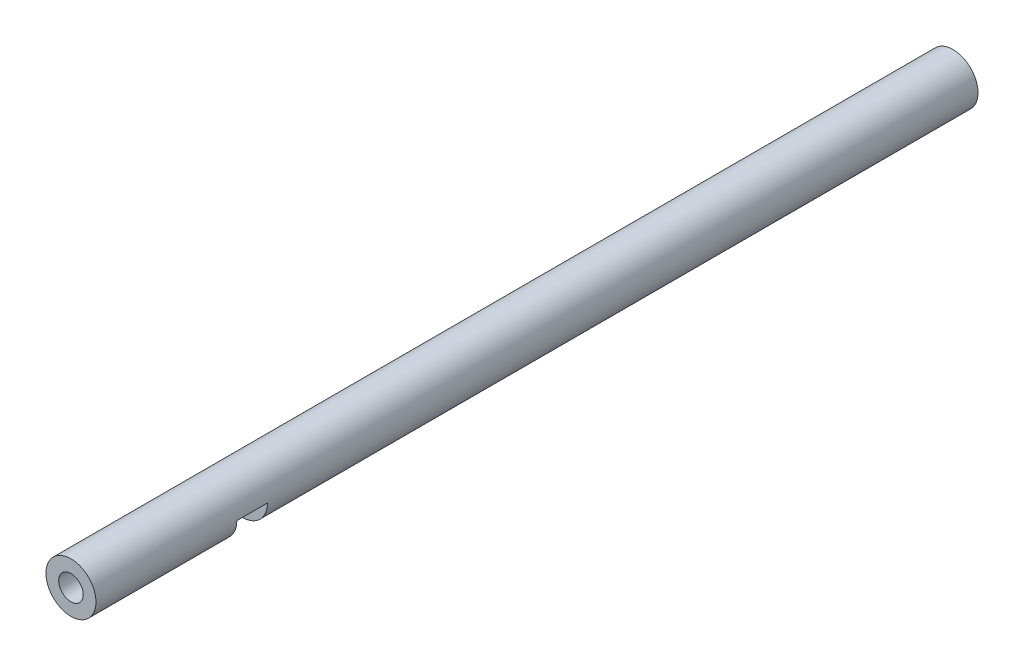
ISO-10303-21;
HEADER;
FILE_DESCRIPTION(('STEP AP214'),'2;1');
FILE_NAME('part.step','',(''),(''),'','','');
FILE_SCHEMA(('AUTOMOTIVE_DESIGN { 1 0 10303 214 1 1 1 1 }'));
ENDSEC;
DATA;
#1=APPLICATION_CONTEXT('core data for automotive mechanical design processes');
#2=APPLICATION_PROTOCOL_DEFINITION('international standard','automotive_design',2000,#1);
#3=PRODUCT_CONTEXT('',#1,'mechanical');
#4=PRODUCT('Part','Part','',(#3));
#5=PRODUCT_RELATED_PRODUCT_CATEGORY('part','',(#4));
#6=PRODUCT_DEFINITION_FORMATION('','',#4);
#7=PRODUCT_DEFINITION_CONTEXT('part definition',#1,'design');
#8=PRODUCT_DEFINITION('design','',#6,#7);
#9=PRODUCT_DEFINITION_SHAPE('','',#8);
#10=(LENGTH_UNIT() NAMED_UNIT(*) SI_UNIT(.MILLI.,.METRE.));
#11=(NAMED_UNIT(*) PLANE_ANGLE_UNIT() SI_UNIT($,.RADIAN.));
#12=(NAMED_UNIT(*) SI_UNIT($,.STERADIAN.) SOLID_ANGLE_UNIT());
#13=UNCERTAINTY_MEASURE_WITH_UNIT(LENGTH_MEASURE(1.E-05),#10,'distance_accuracy_value','');
#14=(GEOMETRIC_REPRESENTATION_CONTEXT(3) GLOBAL_UNCERTAINTY_ASSIGNED_CONTEXT((#13)) GLOBAL_UNIT_ASSIGNED_CONTEXT((#10,
#11,#12)) REPRESENTATION_CONTEXT('',''));
#15=CARTESIAN_POINT('',(0.,0.,0.));
#16=DIRECTION('',(0.,0.,1.));
#17=DIRECTION('',(1.,0.,0.));
#18=AXIS2_PLACEMENT_3D('',#15,#16,#17);
#19=CARTESIAN_POINT('',(0.,0.,228.6));
#20=DIRECTION('',(0.,0.,-1.));
#21=DIRECTION('',(-1.,0.,0.));
#22=AXIS2_PLACEMENT_3D('',#19,#20,#21);
#23=CYLINDRICAL_SURFACE('',#22,3.175);
#24=CARTESIAN_POINT('',(0.,0.,228.6));
#25=DIRECTION('',(0.,0.,1.));
#26=DIRECTION('',(1.,0.,0.));
#27=AXIS2_PLACEMENT_3D('',#24,#25,#26);
#28=CIRCLE('',#27,3.175);
#29=CARTESIAN_POINT('',(3.175,0.,228.6));
#30=VERTEX_POINT('',#29);
#31=EDGE_CURVE('E99',#30,#30,#28,.T.);
#32=ORIENTED_EDGE('',*,*,#31,.T.);
#33=EDGE_LOOP('',(#32));
#34=FACE_BOUND('',#33,.T.);
#35=CARTESIAN_POINT('',(0.,0.,0.));
#36=DIRECTION('',(0.,0.,1.));
#37=DIRECTION('',(1.,0.,0.));
#38=AXIS2_PLACEMENT_3D('',#35,#36,#37);
#39=CIRCLE('',#38,3.175);
#40=CARTESIAN_POINT('',(3.175,0.,0.));
#41=VERTEX_POINT('',#40);
#42=EDGE_CURVE('E98',#41,#41,#39,.T.);
#43=ORIENTED_EDGE('',*,*,#42,.F.);
#44=EDGE_LOOP('',(#43));
#45=FACE_BOUND('',#44,.T.);
#46=CARTESIAN_POINT('',(0.,0.,192.0875));
#47=DIRECTION('',(0.,0.,1.));
#48=DIRECTION('',(1.,0.,0.));
#49=AXIS2_PLACEMENT_3D('',#46,#47,#48);
#50=CIRCLE('',#49,3.175);
#51=CARTESIAN_POINT('',(-3.175,0.,192.0875));
#52=VERTEX_POINT('',#51);
#53=CARTESIAN_POINT('',(3.175,0.,192.0875));
#54=VERTEX_POINT('',#53);
#55=EDGE_CURVE('E113',#52,#54,#50,.T.);
#56=ORIENTED_EDGE('',*,*,#55,.F.);
#57=DIRECTION('',(0.,0.,-1.));
#58=VECTOR('',#57,1.);
#59=CARTESIAN_POINT('',(-3.175,0.,228.6));
#60=LINE('',#59,#58);
#61=CARTESIAN_POINT('',(-3.175,0.,184.15));
#62=VERTEX_POINT('',#61);
#63=EDGE_CURVE('E11',#52,#62,#60,.T.);
#64=ORIENTED_EDGE('',*,*,#63,.T.);
#65=CARTESIAN_POINT('',(0.,0.,184.15));
#66=DIRECTION('',(0.,0.,-1.));
#67=DIRECTION('',(-1.,0.,0.));
#68=AXIS2_PLACEMENT_3D('',#65,#66,#67);
#69=CIRCLE('',#68,3.175);
#70=CARTESIAN_POINT('',(3.175,0.,184.15));
#71=VERTEX_POINT('',#70);
#72=EDGE_CURVE('E41',#71,#62,#69,.T.);
#73=ORIENTED_EDGE('',*,*,#72,.F.);
#74=DIRECTION('',(0.,0.,-1.));
#75=VECTOR('',#74,1.);
#76=CARTESIAN_POINT('',(3.175,0.,228.6));
#77=LINE('',#76,#75);
#78=EDGE_CURVE('E108',#71,#54,#77,.F.);
#79=ORIENTED_EDGE('',*,*,#78,.T.);
#80=EDGE_LOOP('',(#56,#64,#73,#79));
#81=FACE_BOUND('',#80,.T.);
#82=ADVANCED_FACE('F33',(#34,#45,#81),#23,.F.);
#83=CARTESIAN_POINT('',(0.,0.,228.6));
#84=DIRECTION('',(0.,0.,1.));
#85=DIRECTION('',(1.,0.,0.));
#86=AXIS2_PLACEMENT_3D('',#83,#84,#85);
#87=PLANE('',#86);
#88=CARTESIAN_POINT('',(0.,0.,228.6));
#89=DIRECTION('',(0.,0.,1.));
#90=DIRECTION('',(1.,0.,0.));
#91=AXIS2_PLACEMENT_3D('',#88,#89,#90);
#92=CIRCLE('',#91,6.477);
#93=CARTESIAN_POINT('',(6.477,0.,228.6));
#94=VERTEX_POINT('',#93);
#95=EDGE_CURVE('E105',#94,#94,#92,.T.);
#96=ORIENTED_EDGE('',*,*,#95,.T.);
#97=EDGE_LOOP('',(#96));
#98=FACE_BOUND('',#97,.T.);
#99=ORIENTED_EDGE('',*,*,#31,.F.);
#100=EDGE_LOOP('',(#99));
#101=FACE_BOUND('',#100,.T.);
#102=ADVANCED_FACE('F126',(#98,#101),#87,.T.);
#103=CARTESIAN_POINT('',(0.,0.,0.));
#104=DIRECTION('',(0.,0.,1.));
#105=DIRECTION('',(1.,0.,0.));
#106=AXIS2_PLACEMENT_3D('',#103,#104,#105);
#107=PLANE('',#106);
#108=CARTESIAN_POINT('',(0.,0.,0.));
#109=DIRECTION('',(0.,0.,1.));
#110=DIRECTION('',(1.,0.,0.));
#111=AXIS2_PLACEMENT_3D('',#108,#109,#110);
#112=CIRCLE('',#111,6.477);
#113=CARTESIAN_POINT('',(6.477,0.,0.));
#114=VERTEX_POINT('',#113);
#115=EDGE_CURVE('E102',#114,#114,#112,.T.);
#116=ORIENTED_EDGE('',*,*,#115,.F.);
#117=EDGE_LOOP('',(#116));
#118=FACE_BOUND('',#117,.T.);
#119=ORIENTED_EDGE('',*,*,#42,.T.);
#120=EDGE_LOOP('',(#119));
#121=FACE_BOUND('',#120,.T.);
#122=ADVANCED_FACE('F132',(#118,#121),#107,.F.);
#123=CARTESIAN_POINT('',(0.,0.,228.6));
#124=DIRECTION('',(0.,0.,-1.));
#125=DIRECTION('',(-1.,0.,0.));
#126=AXIS2_PLACEMENT_3D('',#123,#124,#125);
#127=CYLINDRICAL_SURFACE('',#126,6.477);
#128=DIRECTION('',(0.,0.,-1.));
#129=VECTOR('',#128,1.);
#130=CARTESIAN_POINT('',(6.477,0.,192.0875));
#131=LINE('',#130,#129);
#132=CARTESIAN_POINT('',(6.477,0.,192.0875));
#133=VERTEX_POINT('',#132);
#134=CARTESIAN_POINT('',(6.477,0.,184.15));
#135=VERTEX_POINT('',#134);
#136=EDGE_CURVE('E88',#133,#135,#131,.T.);
#137=ORIENTED_EDGE('',*,*,#136,.T.);
#138=CARTESIAN_POINT('',(0.,0.,184.15));
#139=DIRECTION('',(0.,0.,-1.));
#140=DIRECTION('',(-1.,0.,0.));
#141=AXIS2_PLACEMENT_3D('',#138,#139,#140);
#142=CIRCLE('',#141,6.477);
#143=CARTESIAN_POINT('',(-6.477,0.,184.15));
#144=VERTEX_POINT('',#143);
#145=EDGE_CURVE('E81',#135,#144,#142,.T.);
#146=ORIENTED_EDGE('',*,*,#145,.T.);
#147=DIRECTION('',(0.,0.,1.));
#148=VECTOR('',#147,1.);
#149=CARTESIAN_POINT('',(-6.477,0.,192.0875));
#150=LINE('',#149,#148);
#151=CARTESIAN_POINT('',(-6.477,0.,192.0875));
#152=VERTEX_POINT('',#151);
#153=EDGE_CURVE('E87',#144,#152,#150,.T.);
#154=ORIENTED_EDGE('',*,*,#153,.T.);
#155=CARTESIAN_POINT('',(0.,0.,192.0875));
#156=DIRECTION('',(0.,0.,1.));
#157=DIRECTION('',(1.,0.,0.));
#158=AXIS2_PLACEMENT_3D('',#155,#156,#157);
#159=CIRCLE('',#158,6.477);
#160=EDGE_CURVE('E73',#152,#133,#159,.T.);
#161=ORIENTED_EDGE('',*,*,#160,.T.);
#162=EDGE_LOOP('',(#137,#146,#154,#161));
#163=FACE_BOUND('',#162,.T.);
#164=ORIENTED_EDGE('',*,*,#95,.F.);
#165=EDGE_LOOP('',(#164));
#166=FACE_BOUND('',#165,.T.);
#167=ORIENTED_EDGE('',*,*,#115,.T.);
#168=EDGE_LOOP('',(#167));
#169=FACE_BOUND('',#168,.T.);
#170=ADVANCED_FACE('F35',(#163,#166,#169),#127,.T.);
#171=CARTESIAN_POINT('',(-6.477,-6.477,184.15));
#172=DIRECTION('',(0.,0.,-1.));
#173=DIRECTION('',(-1.,0.,0.));
#174=AXIS2_PLACEMENT_3D('',#171,#172,#173);
#175=PLANE('',#174);
#176=DIRECTION('',(-1.,0.,0.));
#177=VECTOR('',#176,1.);
#178=CARTESIAN_POINT('',(-6.477,0.,184.15));
#179=LINE('',#178,#177);
#180=EDGE_CURVE('E48',#135,#71,#179,.T.);
#181=ORIENTED_EDGE('',*,*,#180,.T.);
#182=ORIENTED_EDGE('',*,*,#72,.T.);
#183=EDGE_CURVE('E95',#62,#144,#179,.T.);
#184=ORIENTED_EDGE('',*,*,#183,.T.);
#185=ORIENTED_EDGE('',*,*,#145,.F.);
#186=EDGE_LOOP('',(#181,#182,#184,#185));
#187=FACE_BOUND('',#186,.T.);
#188=ADVANCED_FACE('F116',(#187),#175,.F.);
#189=CARTESIAN_POINT('',(-6.477,-6.477,192.0875));
#190=DIRECTION('',(0.,0.,1.));
#191=DIRECTION('',(1.,0.,0.));
#192=AXIS2_PLACEMENT_3D('',#189,#190,#191);
#193=PLANE('',#192);
#194=DIRECTION('',(1.,0.,0.));
#195=VECTOR('',#194,1.);
#196=CARTESIAN_POINT('',(-6.477,0.,192.0875));
#197=LINE('',#196,#195);
#198=EDGE_CURVE('E76',#152,#52,#197,.T.);
#199=ORIENTED_EDGE('',*,*,#198,.T.);
#200=ORIENTED_EDGE('',*,*,#55,.T.);
#201=EDGE_CURVE('E53',#54,#133,#197,.T.);
#202=ORIENTED_EDGE('',*,*,#201,.T.);
#203=ORIENTED_EDGE('',*,*,#160,.F.);
#204=EDGE_LOOP('',(#199,#200,#202,#203));
#205=FACE_BOUND('',#204,.T.);
#206=ADVANCED_FACE('F75',(#205),#193,.F.);
#207=CARTESIAN_POINT('',(0.,0.,0.));
#208=DIRECTION('',(0.,-1.,0.));
#209=DIRECTION('',(0.,0.,-1.));
#210=AXIS2_PLACEMENT_3D('',#207,#208,#209);
#211=PLANE('',#210);
#212=ORIENTED_EDGE('',*,*,#198,.F.);
#213=ORIENTED_EDGE('',*,*,#153,.F.);
#214=ORIENTED_EDGE('',*,*,#183,.F.);
#215=ORIENTED_EDGE('',*,*,#63,.F.);
#216=EDGE_LOOP('',(#212,#213,#214,#215));
#217=FACE_BOUND('',#216,.T.);
#218=ADVANCED_FACE('F85',(#217),#211,.T.);
#219=ORIENTED_EDGE('',*,*,#180,.F.);
#220=ORIENTED_EDGE('',*,*,#136,.F.);
#221=ORIENTED_EDGE('',*,*,#201,.F.);
#222=ORIENTED_EDGE('',*,*,#78,.F.);
#223=EDGE_LOOP('',(#219,#220,#221,#222));
#224=FACE_BOUND('',#223,.T.);
#225=ADVANCED_FACE('F118',(#224),#211,.T.);
#226=CLOSED_SHELL('',(#82,#102,#122,#170,#188,#206,#218,#225));
#227=MANIFOLD_SOLID_BREP('B2',#226);
#228=ADVANCED_BREP_SHAPE_REPRESENTATION('',(#18,#227),#14);
#229=SHAPE_DEFINITION_REPRESENTATION(#9,#228);
ENDSEC;
END-ISO-10303-21;
